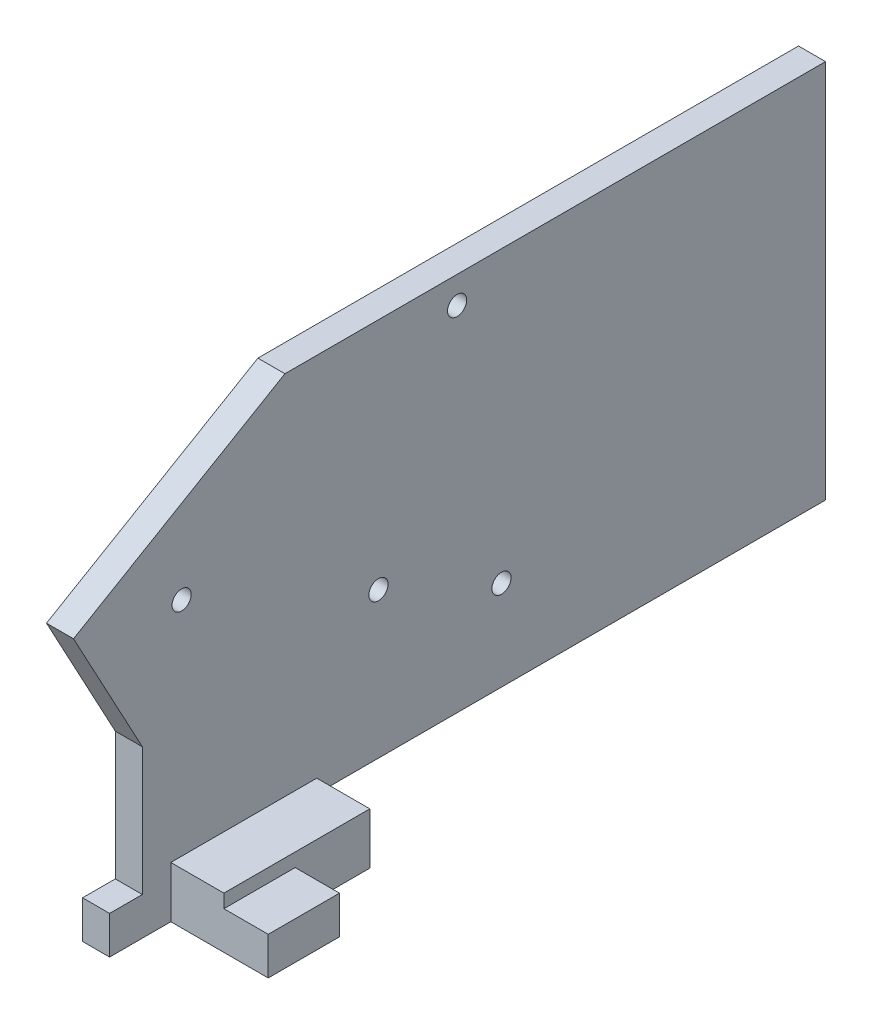
ISO-10303-21;
HEADER;
FILE_DESCRIPTION(('STEP AP214'),'2;1');
FILE_NAME('part.step','',(''),(''),'','','');
FILE_SCHEMA(('AUTOMOTIVE_DESIGN { 1 0 10303 214 1 1 1 1 }'));
ENDSEC;
DATA;
#1=APPLICATION_CONTEXT('core data for automotive mechanical design processes');
#2=APPLICATION_PROTOCOL_DEFINITION('international standard','automotive_design',2000,#1);
#3=PRODUCT_CONTEXT('',#1,'mechanical');
#4=PRODUCT('Part','Part','',(#3));
#5=PRODUCT_RELATED_PRODUCT_CATEGORY('part','',(#4));
#6=PRODUCT_DEFINITION_FORMATION('','',#4);
#7=PRODUCT_DEFINITION_CONTEXT('part definition',#1,'design');
#8=PRODUCT_DEFINITION('design','',#6,#7);
#9=PRODUCT_DEFINITION_SHAPE('','',#8);
#10=(LENGTH_UNIT() NAMED_UNIT(*) SI_UNIT(.MILLI.,.METRE.));
#11=(NAMED_UNIT(*) PLANE_ANGLE_UNIT() SI_UNIT($,.RADIAN.));
#12=(NAMED_UNIT(*) SI_UNIT($,.STERADIAN.) SOLID_ANGLE_UNIT());
#13=UNCERTAINTY_MEASURE_WITH_UNIT(LENGTH_MEASURE(1.E-05),#10,'distance_accuracy_value','');
#14=(GEOMETRIC_REPRESENTATION_CONTEXT(3) GLOBAL_UNCERTAINTY_ASSIGNED_CONTEXT((#13)) GLOBAL_UNIT_ASSIGNED_CONTEXT((#10,
#11,#12)) REPRESENTATION_CONTEXT('',''));
#15=CARTESIAN_POINT('',(0.,0.,0.));
#16=DIRECTION('',(0.,0.,1.));
#17=DIRECTION('',(1.,0.,0.));
#18=AXIS2_PLACEMENT_3D('',#15,#16,#17);
#19=CARTESIAN_POINT('',(-6.35,0.,-8.48062137768407));
#20=DIRECTION('',(0.,0.,-1.));
#21=DIRECTION('',(0.,1.,0.));
#22=AXIS2_PLACEMENT_3D('',#19,#20,#21);
#23=PLANE('',#22);
#24=DIRECTION('',(0.,1.,0.));
#25=VECTOR('',#24,1.);
#26=CARTESIAN_POINT('',(0.,0.,-8.48062137768407));
#27=LINE('',#26,#25);
#28=CARTESIAN_POINT('',(0.,-8.89,-8.48062137768407));
#29=VERTEX_POINT('',#28);
#30=CARTESIAN_POINT('',(0.,0.,-8.48062137768407));
#31=VERTEX_POINT('',#30);
#32=EDGE_CURVE('E200',#29,#31,#27,.T.);
#33=ORIENTED_EDGE('',*,*,#32,.T.);
#34=DIRECTION('',(1.,0.,0.));
#35=VECTOR('',#34,1.);
#36=CARTESIAN_POINT('',(-6.35,0.,-8.48062137768407));
#37=LINE('',#36,#35);
#38=CARTESIAN_POINT('',(-6.35,0.,-8.48062137768407));
#39=VERTEX_POINT('',#38);
#40=EDGE_CURVE('E45',#39,#31,#37,.T.);
#41=ORIENTED_EDGE('',*,*,#40,.F.);
#42=DIRECTION('',(0.,1.,0.));
#43=VECTOR('',#42,1.);
#44=CARTESIAN_POINT('',(-6.35,0.,-8.48062137768407));
#45=LINE('',#44,#43);
#46=CARTESIAN_POINT('',(-6.35,-8.89,-8.48062137768407));
#47=VERTEX_POINT('',#46);
#48=EDGE_CURVE('E201',#47,#39,#45,.T.);
#49=ORIENTED_EDGE('',*,*,#48,.F.);
#50=DIRECTION('',(1.,0.,0.));
#51=VECTOR('',#50,1.);
#52=CARTESIAN_POINT('',(-6.35,-8.89,-8.48062137768407));
#53=LINE('',#52,#51);
#54=EDGE_CURVE('E40',#47,#29,#53,.T.);
#55=ORIENTED_EDGE('',*,*,#54,.T.);
#56=EDGE_LOOP('',(#33,#41,#49,#55));
#57=FACE_BOUND('',#56,.T.);
#58=ADVANCED_FACE('F37',(#57),#23,.F.);
#59=CARTESIAN_POINT('',(-6.35,0.,0.));
#60=DIRECTION('',(0.,-1.,0.));
#61=DIRECTION('',(0.,0.,-1.));
#62=AXIS2_PLACEMENT_3D('',#59,#60,#61);
#63=PLANE('',#62);
#64=DIRECTION('',(0.,0.,-1.));
#65=VECTOR('',#64,1.);
#66=CARTESIAN_POINT('',(0.,0.,0.));
#67=LINE('',#66,#65);
#68=CARTESIAN_POINT('',(0.,0.,-16.170941539758));
#69=VERTEX_POINT('',#68);
#70=EDGE_CURVE('E260',#31,#69,#67,.T.);
#71=ORIENTED_EDGE('',*,*,#70,.T.);
#72=DIRECTION('',(1.,0.,0.));
#73=VECTOR('',#72,1.);
#74=CARTESIAN_POINT('',(-6.35,0.,-16.170941539758));
#75=LINE('',#74,#73);
#76=CARTESIAN_POINT('',(-6.35,0.,-16.170941539758));
#77=VERTEX_POINT('',#76);
#78=EDGE_CURVE('E276',#77,#69,#75,.T.);
#79=ORIENTED_EDGE('',*,*,#78,.F.);
#80=DIRECTION('',(0.,0.,-1.));
#81=VECTOR('',#80,1.);
#82=CARTESIAN_POINT('',(-6.35,0.,0.));
#83=LINE('',#82,#81);
#84=EDGE_CURVE('E225',#39,#77,#83,.T.);
#85=ORIENTED_EDGE('',*,*,#84,.F.);
#86=ORIENTED_EDGE('',*,*,#40,.T.);
#87=EDGE_LOOP('',(#71,#79,#85,#86));
#88=FACE_BOUND('',#87,.T.);
#89=ADVANCED_FACE('F309',(#88),#63,.F.);
#90=CARTESIAN_POINT('',(-6.35,0.,-16.170941539758));
#91=DIRECTION('',(0.,0.,1.));
#92=DIRECTION('',(0.,-1.,0.));
#93=AXIS2_PLACEMENT_3D('',#90,#91,#92);
#94=PLANE('',#93);
#95=DIRECTION('',(0.,-1.,0.));
#96=VECTOR('',#95,1.);
#97=CARTESIAN_POINT('',(0.,0.,-16.170941539758));
#98=LINE('',#97,#96);
#99=CARTESIAN_POINT('',(0.,30.0580976939271,-16.170941539758));
#100=VERTEX_POINT('',#99);
#101=EDGE_CURVE('E257',#100,#69,#98,.T.);
#102=ORIENTED_EDGE('',*,*,#101,.F.);
#103=DIRECTION('',(1.,0.,0.));
#104=VECTOR('',#103,1.);
#105=CARTESIAN_POINT('',(-6.35,30.0580976939271,-16.170941539758));
#106=LINE('',#105,#104);
#107=CARTESIAN_POINT('',(-6.35,30.0580976939271,-16.170941539758));
#108=VERTEX_POINT('',#107);
#109=EDGE_CURVE('E278',#108,#100,#106,.T.);
#110=ORIENTED_EDGE('',*,*,#109,.F.);
#111=DIRECTION('',(0.,-1.,0.));
#112=VECTOR('',#111,1.);
#113=CARTESIAN_POINT('',(-6.35,0.,-16.170941539758));
#114=LINE('',#113,#112);
#115=EDGE_CURVE('E222',#108,#77,#114,.T.);
#116=ORIENTED_EDGE('',*,*,#115,.T.);
#117=ORIENTED_EDGE('',*,*,#78,.T.);
#118=EDGE_LOOP('',(#102,#110,#116,#117));
#119=FACE_BOUND('',#118,.T.);
#120=ADVANCED_FACE('F334',(#119),#94,.T.);
#121=CARTESIAN_POINT('',(-6.35,13.4939914495989,-25.0822571014706));
#122=DIRECTION('',(0.,-0.473777543319094,0.880644559085289));
#123=DIRECTION('',(0.,-0.880644559085289,-0.473777543319095));
#124=AXIS2_PLACEMENT_3D('',#121,#122,#123);
#125=PLANE('',#124);
#126=DIRECTION('',(0.,-0.880644559085289,-0.473777543319095));
#127=VECTOR('',#126,1.);
#128=CARTESIAN_POINT('',(0.,13.4939914495989,-25.0822571014706));
#129=LINE('',#128,#127);
#130=CARTESIAN_POINT('',(0.,60.1161953878542,0.));
#131=VERTEX_POINT('',#130);
#132=EDGE_CURVE('E254',#131,#100,#129,.T.);
#133=ORIENTED_EDGE('',*,*,#132,.F.);
#134=DIRECTION('',(1.,0.,0.));
#135=VECTOR('',#134,1.);
#136=CARTESIAN_POINT('',(-6.35,60.1161953878542,0.));
#137=LINE('',#136,#135);
#138=CARTESIAN_POINT('',(-6.35,60.1161953878542,0.));
#139=VERTEX_POINT('',#138);
#140=EDGE_CURVE('E280',#139,#131,#137,.T.);
#141=ORIENTED_EDGE('',*,*,#140,.F.);
#142=DIRECTION('',(0.,-0.880644559085289,-0.473777543319095));
#143=VECTOR('',#142,1.);
#144=CARTESIAN_POINT('',(-6.35,13.4939914495989,-25.0822571014706));
#145=LINE('',#144,#143);
#146=EDGE_CURVE('E219',#139,#108,#145,.T.);
#147=ORIENTED_EDGE('',*,*,#146,.T.);
#148=ORIENTED_EDGE('',*,*,#109,.T.);
#149=EDGE_LOOP('',(#133,#141,#147,#148));
#150=FACE_BOUND('',#149,.T.);
#151=ADVANCED_FACE('F339',(#150),#125,.T.);
#152=CARTESIAN_POINT('',(-6.35,44.7635875945771,26.2152208413271));
#153=DIRECTION('',(0.,0.862912379131636,0.505353565280171));
#154=DIRECTION('',(0.,-0.505353565280171,0.862912379131636));
#155=AXIS2_PLACEMENT_3D('',#152,#153,#154);
#156=PLANE('',#155);
#157=DIRECTION('',(0.,-0.505353565280171,0.862912379131636));
#158=VECTOR('',#157,1.);
#159=CARTESIAN_POINT('',(0.,44.7635875945771,26.2152208413271));
#160=LINE('',#159,#158);
#161=CARTESIAN_POINT('',(0.,89.2048,-49.6700107331192));
#162=VERTEX_POINT('',#161);
#163=EDGE_CURVE('E251',#162,#131,#160,.T.);
#164=ORIENTED_EDGE('',*,*,#163,.F.);
#165=DIRECTION('',(1.,0.,0.));
#166=VECTOR('',#165,1.);
#167=CARTESIAN_POINT('',(-6.35,89.2048,-49.6700107331192));
#168=LINE('',#167,#166);
#169=CARTESIAN_POINT('',(-6.35,89.2048,-49.6700107331192));
#170=VERTEX_POINT('',#169);
#171=EDGE_CURVE('E282',#170,#162,#168,.T.);
#172=ORIENTED_EDGE('',*,*,#171,.F.);
#173=DIRECTION('',(0.,-0.505353565280171,0.862912379131636));
#174=VECTOR('',#173,1.);
#175=CARTESIAN_POINT('',(-6.35,44.7635875945771,26.2152208413271));
#176=LINE('',#175,#174);
#177=EDGE_CURVE('E216',#170,#139,#176,.T.);
#178=ORIENTED_EDGE('',*,*,#177,.T.);
#179=ORIENTED_EDGE('',*,*,#140,.T.);
#180=EDGE_LOOP('',(#164,#172,#178,#179));
#181=FACE_BOUND('',#180,.T.);
#182=ADVANCED_FACE('F346',(#181),#156,.T.);
#183=CARTESIAN_POINT('',(-6.35,89.2048,0.));
#184=DIRECTION('',(0.,-1.,0.));
#185=DIRECTION('',(0.,0.,-1.));
#186=AXIS2_PLACEMENT_3D('',#183,#184,#185);
#187=PLANE('',#186);
#188=DIRECTION('',(0.,0.,-1.));
#189=VECTOR('',#188,1.);
#190=CARTESIAN_POINT('',(0.,89.2048,0.));
#191=LINE('',#190,#189);
#192=CARTESIAN_POINT('',(0.,89.2048,-176.670010733119));
#193=VERTEX_POINT('',#192);
#194=EDGE_CURVE('E249',#162,#193,#191,.T.);
#195=ORIENTED_EDGE('',*,*,#194,.T.);
#196=DIRECTION('',(1.,0.,0.));
#197=VECTOR('',#196,1.);
#198=CARTESIAN_POINT('',(-6.35,89.2048,-176.670010733119));
#199=LINE('',#198,#197);
#200=CARTESIAN_POINT('',(-6.35,89.2048,-176.670010733119));
#201=VERTEX_POINT('',#200);
#202=EDGE_CURVE('E284',#201,#193,#199,.T.);
#203=ORIENTED_EDGE('',*,*,#202,.F.);
#204=DIRECTION('',(0.,0.,-1.));
#205=VECTOR('',#204,1.);
#206=CARTESIAN_POINT('',(-6.35,89.2048,0.));
#207=LINE('',#206,#205);
#208=EDGE_CURVE('E214',#170,#201,#207,.T.);
#209=ORIENTED_EDGE('',*,*,#208,.F.);
#210=ORIENTED_EDGE('',*,*,#171,.T.);
#211=EDGE_LOOP('',(#195,#203,#209,#210));
#212=FACE_BOUND('',#211,.T.);
#213=ADVANCED_FACE('F350',(#212),#187,.F.);
#214=CARTESIAN_POINT('',(-6.35,0.,-176.670010733119));
#215=DIRECTION('',(0.,0.,1.));
#216=DIRECTION('',(0.,-1.,0.));
#217=AXIS2_PLACEMENT_3D('',#214,#215,#216);
#218=PLANE('',#217);
#219=DIRECTION('',(0.,-1.,0.));
#220=VECTOR('',#219,1.);
#221=CARTESIAN_POINT('',(0.,0.,-176.670010733119));
#222=LINE('',#221,#220);
#223=CARTESIAN_POINT('',(0.,0.,-176.670010733119));
#224=VERTEX_POINT('',#223);
#225=EDGE_CURVE('E246',#193,#224,#222,.T.);
#226=ORIENTED_EDGE('',*,*,#225,.T.);
#227=DIRECTION('',(1.,0.,0.));
#228=VECTOR('',#227,1.);
#229=CARTESIAN_POINT('',(-6.35,0.,-176.670010733119));
#230=LINE('',#229,#228);
#231=CARTESIAN_POINT('',(-6.35,0.,-176.670010733119));
#232=VERTEX_POINT('',#231);
#233=EDGE_CURVE('E287',#232,#224,#230,.T.);
#234=ORIENTED_EDGE('',*,*,#233,.F.);
#235=DIRECTION('',(0.,-1.,0.));
#236=VECTOR('',#235,1.);
#237=CARTESIAN_POINT('',(-6.35,0.,-176.670010733119));
#238=LINE('',#237,#236);
#239=EDGE_CURVE('E212',#201,#232,#238,.T.);
#240=ORIENTED_EDGE('',*,*,#239,.F.);
#241=ORIENTED_EDGE('',*,*,#202,.T.);
#242=EDGE_LOOP('',(#226,#234,#240,#241));
#243=FACE_BOUND('',#242,.T.);
#244=ADVANCED_FACE('F354',(#243),#218,.F.);
#245=CARTESIAN_POINT('',(-6.35,0.,0.));
#246=DIRECTION('',(0.,-1.,0.));
#247=DIRECTION('',(0.,0.,-1.));
#248=AXIS2_PLACEMENT_3D('',#245,#246,#247);
#249=PLANE('',#248);
#250=DIRECTION('',(0.,0.,-1.));
#251=VECTOR('',#250,1.);
#252=CARTESIAN_POINT('',(0.,0.,0.));
#253=LINE('',#252,#251);
#254=CARTESIAN_POINT('',(0.,0.,-57.15));
#255=VERTEX_POINT('',#254);
#256=EDGE_CURVE('E243',#255,#224,#253,.T.);
#257=ORIENTED_EDGE('',*,*,#256,.F.);
#258=DIRECTION('',(1.,0.,0.));
#259=VECTOR('',#258,1.);
#260=CARTESIAN_POINT('',(-6.35,0.,-57.15));
#261=LINE('',#260,#259);
#262=CARTESIAN_POINT('',(-6.35,0.,-57.15));
#263=VERTEX_POINT('',#262);
#264=EDGE_CURVE('E289',#263,#255,#261,.T.);
#265=ORIENTED_EDGE('',*,*,#264,.F.);
#266=DIRECTION('',(0.,0.,-1.));
#267=VECTOR('',#266,1.);
#268=CARTESIAN_POINT('',(-6.35,0.,0.));
#269=LINE('',#268,#267);
#270=EDGE_CURVE('E209',#263,#232,#269,.T.);
#271=ORIENTED_EDGE('',*,*,#270,.T.);
#272=ORIENTED_EDGE('',*,*,#233,.T.);
#273=EDGE_LOOP('',(#257,#265,#271,#272));
#274=FACE_BOUND('',#273,.T.);
#275=ADVANCED_FACE('F358',(#274),#249,.T.);
#276=CARTESIAN_POINT('',(-6.35,0.,-57.15));
#277=DIRECTION('',(0.,0.,1.));
#278=DIRECTION('',(1.,0.,0.));
#279=AXIS2_PLACEMENT_3D('',#276,#277,#278);
#280=PLANE('',#279);
#281=ORIENTED_EDGE('',*,*,#264,.T.);
#282=DIRECTION('',(0.,1.,0.));
#283=VECTOR('',#282,1.);
#284=CARTESIAN_POINT('',(0.,0.,-57.15));
#285=LINE('',#284,#283);
#286=CARTESIAN_POINT('',(0.,3.175,-57.15));
#287=VERTEX_POINT('',#286);
#288=EDGE_CURVE('E11',#255,#287,#285,.T.);
#289=ORIENTED_EDGE('',*,*,#288,.T.);
#290=DIRECTION('',(-1.,0.,0.));
#291=VECTOR('',#290,1.);
#292=CARTESIAN_POINT('',(12.4714,3.175,-57.15));
#293=LINE('',#292,#291);
#294=CARTESIAN_POINT('',(12.4714,3.175,-57.15));
#295=VERTEX_POINT('',#294);
#296=EDGE_CURVE('E190',#295,#287,#293,.T.);
#297=ORIENTED_EDGE('',*,*,#296,.F.);
#298=DIRECTION('',(0.,1.,0.));
#299=VECTOR('',#298,1.);
#300=CARTESIAN_POINT('',(12.4714,0.,-57.15));
#301=LINE('',#300,#299);
#302=CARTESIAN_POINT('',(12.4714,-8.89,-57.15));
#303=VERTEX_POINT('',#302);
#304=EDGE_CURVE('E189',#303,#295,#301,.T.);
#305=ORIENTED_EDGE('',*,*,#304,.F.);
#306=DIRECTION('',(1.,0.,0.));
#307=VECTOR('',#306,1.);
#308=CARTESIAN_POINT('',(-6.35,-8.89,-57.15));
#309=LINE('',#308,#307);
#310=CARTESIAN_POINT('',(-6.35,-8.89,-57.15));
#311=VERTEX_POINT('',#310);
#312=EDGE_CURVE('E291',#311,#303,#309,.T.);
#313=ORIENTED_EDGE('',*,*,#312,.F.);
#314=DIRECTION('',(0.,-1.,0.));
#315=VECTOR('',#314,1.);
#316=CARTESIAN_POINT('',(-6.35,0.,-57.15));
#317=LINE('',#316,#315);
#318=EDGE_CURVE('E207',#263,#311,#317,.T.);
#319=ORIENTED_EDGE('',*,*,#318,.F.);
#320=EDGE_LOOP('',(#281,#289,#297,#305,#313,#319));
#321=FACE_BOUND('',#320,.T.);
#322=ADVANCED_FACE('F361',(#321),#280,.F.);
#323=CARTESIAN_POINT('',(-6.35,82.8548,-90.1192049843012));
#324=DIRECTION('',(1.,0.,0.));
#325=DIRECTION('',(0.,0.,-1.));
#326=AXIS2_PLACEMENT_3D('',#323,#324,#325);
#327=CYLINDRICAL_SURFACE('',#326,2.2479);
#328=CARTESIAN_POINT('',(-6.35,82.8548,-90.1192049843012));
#329=DIRECTION('',(1.,0.,0.));
#330=DIRECTION('',(0.,0.,-1.));
#331=AXIS2_PLACEMENT_3D('',#328,#329,#330);
#332=CIRCLE('',#331,2.2479);
#333=CARTESIAN_POINT('',(-6.35,82.8548,-92.3671049843012));
#334=VERTEX_POINT('',#333);
#335=EDGE_CURVE('E233',#334,#334,#332,.T.);
#336=ORIENTED_EDGE('',*,*,#335,.F.);
#337=EDGE_LOOP('',(#336));
#338=FACE_BOUND('',#337,.T.);
#339=CARTESIAN_POINT('',(0.,82.8548,-90.1192049843012));
#340=DIRECTION('',(1.,0.,0.));
#341=DIRECTION('',(0.,0.,-1.));
#342=AXIS2_PLACEMENT_3D('',#339,#340,#341);
#343=CIRCLE('',#342,2.2479);
#344=CARTESIAN_POINT('',(0.,82.8548,-92.3671049843012));
#345=VERTEX_POINT('',#344);
#346=EDGE_CURVE('E269',#345,#345,#343,.T.);
#347=ORIENTED_EDGE('',*,*,#346,.T.);
#348=EDGE_LOOP('',(#347));
#349=FACE_BOUND('',#348,.T.);
#350=ADVANCED_FACE('F364',(#338,#349),#327,.F.);
#351=CARTESIAN_POINT('',(-6.35,34.29,-71.6420655524815));
#352=DIRECTION('',(1.,0.,0.));
#353=DIRECTION('',(0.,0.,-1.));
#354=AXIS2_PLACEMENT_3D('',#351,#352,#353);
#355=CYLINDRICAL_SURFACE('',#354,2.2479);
#356=CARTESIAN_POINT('',(-6.35,34.29,-71.6420655524815));
#357=DIRECTION('',(1.,0.,0.));
#358=DIRECTION('',(0.,0.,-1.));
#359=AXIS2_PLACEMENT_3D('',#356,#357,#358);
#360=CIRCLE('',#359,2.2479);
#361=CARTESIAN_POINT('',(-6.35,34.29,-73.8899655524815));
#362=VERTEX_POINT('',#361);
#363=EDGE_CURVE('E230',#362,#362,#360,.T.);
#364=ORIENTED_EDGE('',*,*,#363,.F.);
#365=EDGE_LOOP('',(#364));
#366=FACE_BOUND('',#365,.T.);
#367=CARTESIAN_POINT('',(0.,34.29,-71.6420655524815));
#368=DIRECTION('',(1.,0.,0.));
#369=DIRECTION('',(0.,0.,-1.));
#370=AXIS2_PLACEMENT_3D('',#367,#368,#369);
#371=CIRCLE('',#370,2.2479);
#372=CARTESIAN_POINT('',(0.,34.29,-73.8899655524815));
#373=VERTEX_POINT('',#372);
#374=EDGE_CURVE('E266',#373,#373,#371,.T.);
#375=ORIENTED_EDGE('',*,*,#374,.T.);
#376=EDGE_LOOP('',(#375));
#377=FACE_BOUND('',#376,.T.);
#378=ADVANCED_FACE('F326',(#366,#377),#355,.F.);
#379=CARTESIAN_POINT('',(-6.35,21.1455,-100.543356522783));
#380=DIRECTION('',(1.,0.,0.));
#381=DIRECTION('',(0.,0.,-1.));
#382=AXIS2_PLACEMENT_3D('',#379,#380,#381);
#383=CYLINDRICAL_SURFACE('',#382,2.2479);
#384=CARTESIAN_POINT('',(-6.35,21.1455,-100.543356522783));
#385=DIRECTION('',(1.,0.,0.));
#386=DIRECTION('',(0.,0.,-1.));
#387=AXIS2_PLACEMENT_3D('',#384,#385,#386);
#388=CIRCLE('',#387,2.2479);
#389=CARTESIAN_POINT('',(-6.35,21.1455,-102.791256522783));
#390=VERTEX_POINT('',#389);
#391=EDGE_CURVE('E227',#390,#390,#388,.T.);
#392=ORIENTED_EDGE('',*,*,#391,.F.);
#393=EDGE_LOOP('',(#392));
#394=FACE_BOUND('',#393,.T.);
#395=CARTESIAN_POINT('',(0.,21.1455,-100.543356522783));
#396=DIRECTION('',(1.,0.,0.));
#397=DIRECTION('',(0.,0.,-1.));
#398=AXIS2_PLACEMENT_3D('',#395,#396,#397);
#399=CIRCLE('',#398,2.2479);
#400=CARTESIAN_POINT('',(0.,21.1455,-102.791256522783));
#401=VERTEX_POINT('',#400);
#402=EDGE_CURVE('E263',#401,#401,#399,.T.);
#403=ORIENTED_EDGE('',*,*,#402,.T.);
#404=EDGE_LOOP('',(#403));
#405=FACE_BOUND('',#404,.T.);
#406=ADVANCED_FACE('F319',(#394,#405),#383,.F.);
#407=CARTESIAN_POINT('',(-6.35,-8.89000000000001,0.));
#408=DIRECTION('',(0.,1.,0.));
#409=DIRECTION('',(0.,0.,1.));
#410=AXIS2_PLACEMENT_3D('',#407,#408,#409);
#411=PLANE('',#410);
#412=ORIENTED_EDGE('',*,*,#312,.T.);
#413=DIRECTION('',(0.,0.,1.));
#414=VECTOR('',#413,1.);
#415=CARTESIAN_POINT('',(12.4714,-8.89000000000001,0.));
#416=LINE('',#415,#414);
#417=CARTESIAN_POINT('',(12.4714,-8.89,-39.6000000000007));
#418=VERTEX_POINT('',#417);
#419=EDGE_CURVE('E187',#303,#418,#416,.T.);
#420=ORIENTED_EDGE('',*,*,#419,.T.);
#421=DIRECTION('',(-1.,0.,0.));
#422=VECTOR('',#421,1.);
#423=CARTESIAN_POINT('',(22.8854,-8.89,-39.6000000000007));
#424=LINE('',#423,#422);
#425=CARTESIAN_POINT('',(22.8854,-8.89,-39.6000000000007));
#426=VERTEX_POINT('',#425);
#427=EDGE_CURVE('E173',#426,#418,#424,.T.);
#428=ORIENTED_EDGE('',*,*,#427,.F.);
#429=DIRECTION('',(0.,0.,-1.));
#430=VECTOR('',#429,1.);
#431=CARTESIAN_POINT('',(22.8854,-8.89,-39.6000000000007));
#432=LINE('',#431,#430);
#433=CARTESIAN_POINT('',(22.8854,-8.89,-22.86));
#434=VERTEX_POINT('',#433);
#435=EDGE_CURVE('E159',#434,#426,#432,.T.);
#436=ORIENTED_EDGE('',*,*,#435,.F.);
#437=DIRECTION('',(-1.,0.,0.));
#438=VECTOR('',#437,1.);
#439=CARTESIAN_POINT('',(12.4714,-8.89,-22.86));
#440=LINE('',#439,#438);
#441=CARTESIAN_POINT('',(0.,-8.89,-22.86));
#442=VERTEX_POINT('',#441);
#443=EDGE_CURVE('E156',#434,#442,#440,.T.);
#444=ORIENTED_EDGE('',*,*,#443,.T.);
#445=DIRECTION('',(0.,0.,1.));
#446=VECTOR('',#445,1.);
#447=CARTESIAN_POINT('',(0.,-8.89000000000001,0.));
#448=LINE('',#447,#446);
#449=EDGE_CURVE('E241',#442,#29,#448,.T.);
#450=ORIENTED_EDGE('',*,*,#449,.T.);
#451=ORIENTED_EDGE('',*,*,#54,.F.);
#452=DIRECTION('',(0.,0.,1.));
#453=VECTOR('',#452,1.);
#454=CARTESIAN_POINT('',(-6.35,-8.89000000000001,0.));
#455=LINE('',#454,#453);
#456=EDGE_CURVE('E204',#311,#47,#455,.T.);
#457=ORIENTED_EDGE('',*,*,#456,.F.);
#458=EDGE_LOOP('',(#412,#420,#428,#436,#444,#450,#451,#457));
#459=FACE_BOUND('',#458,.T.);
#460=ADVANCED_FACE('F316',(#459),#411,.F.);
#461=CARTESIAN_POINT('',(-6.35,55.3212,-25.4));
#462=DIRECTION('',(1.,0.,0.));
#463=DIRECTION('',(0.,0.,-1.));
#464=AXIS2_PLACEMENT_3D('',#461,#462,#463);
#465=CYLINDRICAL_SURFACE('',#464,2.2479);
#466=CARTESIAN_POINT('',(-6.35,55.3212,-25.4));
#467=DIRECTION('',(1.,0.,0.));
#468=DIRECTION('',(0.,0.,-1.));
#469=AXIS2_PLACEMENT_3D('',#466,#467,#468);
#470=CIRCLE('',#469,2.2479);
#471=CARTESIAN_POINT('',(-6.35,55.3212,-27.6479));
#472=VERTEX_POINT('',#471);
#473=EDGE_CURVE('E236',#472,#472,#470,.T.);
#474=ORIENTED_EDGE('',*,*,#473,.F.);
#475=EDGE_LOOP('',(#474));
#476=FACE_BOUND('',#475,.T.);
#477=CARTESIAN_POINT('',(0.,55.3212,-25.4));
#478=DIRECTION('',(1.,0.,0.));
#479=DIRECTION('',(0.,0.,-1.));
#480=AXIS2_PLACEMENT_3D('',#477,#478,#479);
#481=CIRCLE('',#480,2.2479);
#482=CARTESIAN_POINT('',(0.,55.3212,-27.6479));
#483=VERTEX_POINT('',#482);
#484=EDGE_CURVE('E205',#483,#483,#481,.T.);
#485=ORIENTED_EDGE('',*,*,#484,.T.);
#486=EDGE_LOOP('',(#485));
#487=FACE_BOUND('',#486,.T.);
#488=ADVANCED_FACE('F318',(#476,#487),#465,.F.);
#489=CARTESIAN_POINT('',(-6.35,0.,0.));
#490=DIRECTION('',(1.,0.,0.));
#491=DIRECTION('',(0.,0.,-1.));
#492=AXIS2_PLACEMENT_3D('',#489,#490,#491);
#493=PLANE('',#492);
#494=ORIENTED_EDGE('',*,*,#48,.T.);
#495=ORIENTED_EDGE('',*,*,#84,.T.);
#496=ORIENTED_EDGE('',*,*,#115,.F.);
#497=ORIENTED_EDGE('',*,*,#146,.F.);
#498=ORIENTED_EDGE('',*,*,#177,.F.);
#499=ORIENTED_EDGE('',*,*,#208,.T.);
#500=ORIENTED_EDGE('',*,*,#239,.T.);
#501=ORIENTED_EDGE('',*,*,#270,.F.);
#502=ORIENTED_EDGE('',*,*,#318,.T.);
#503=ORIENTED_EDGE('',*,*,#456,.T.);
#504=EDGE_LOOP('',(#494,#495,#496,#497,#498,#499,#500,#501,#502,#503));
#505=FACE_BOUND('',#504,.T.);
#506=ORIENTED_EDGE('',*,*,#391,.T.);
#507=EDGE_LOOP('',(#506));
#508=FACE_BOUND('',#507,.T.);
#509=ORIENTED_EDGE('',*,*,#363,.T.);
#510=EDGE_LOOP('',(#509));
#511=FACE_BOUND('',#510,.T.);
#512=ORIENTED_EDGE('',*,*,#335,.T.);
#513=EDGE_LOOP('',(#512));
#514=FACE_BOUND('',#513,.T.);
#515=ORIENTED_EDGE('',*,*,#473,.T.);
#516=EDGE_LOOP('',(#515));
#517=FACE_BOUND('',#516,.T.);
#518=ADVANCED_FACE('F312',(#505,#508,#511,#514,#517),#493,.F.);
#519=CARTESIAN_POINT('',(0.,0.,0.));
#520=DIRECTION('',(1.,0.,0.));
#521=DIRECTION('',(0.,0.,-1.));
#522=AXIS2_PLACEMENT_3D('',#519,#520,#521);
#523=PLANE('',#522);
#524=ORIENTED_EDGE('',*,*,#288,.F.);
#525=ORIENTED_EDGE('',*,*,#256,.T.);
#526=ORIENTED_EDGE('',*,*,#225,.F.);
#527=ORIENTED_EDGE('',*,*,#194,.F.);
#528=ORIENTED_EDGE('',*,*,#163,.T.);
#529=ORIENTED_EDGE('',*,*,#132,.T.);
#530=ORIENTED_EDGE('',*,*,#101,.T.);
#531=ORIENTED_EDGE('',*,*,#70,.F.);
#532=ORIENTED_EDGE('',*,*,#32,.F.);
#533=ORIENTED_EDGE('',*,*,#449,.F.);
#534=DIRECTION('',(0.,1.,0.));
#535=VECTOR('',#534,1.);
#536=CARTESIAN_POINT('',(0.,0.,-22.86));
#537=LINE('',#536,#535);
#538=CARTESIAN_POINT('',(0.,3.175,-22.86));
#539=VERTEX_POINT('',#538);
#540=EDGE_CURVE('E176',#442,#539,#537,.T.);
#541=ORIENTED_EDGE('',*,*,#540,.T.);
#542=DIRECTION('',(0.,0.,-1.));
#543=VECTOR('',#542,1.);
#544=CARTESIAN_POINT('',(0.,3.175,0.));
#545=LINE('',#544,#543);
#546=EDGE_CURVE('E172',#539,#287,#545,.T.);
#547=ORIENTED_EDGE('',*,*,#546,.T.);
#548=EDGE_LOOP('',(#524,#525,#526,#527,#528,#529,#530,#531,#532,#533,#541,#547));
#549=FACE_BOUND('',#548,.T.);
#550=ORIENTED_EDGE('',*,*,#402,.F.);
#551=EDGE_LOOP('',(#550));
#552=FACE_BOUND('',#551,.T.);
#553=ORIENTED_EDGE('',*,*,#374,.F.);
#554=EDGE_LOOP('',(#553));
#555=FACE_BOUND('',#554,.T.);
#556=ORIENTED_EDGE('',*,*,#346,.F.);
#557=EDGE_LOOP('',(#556));
#558=FACE_BOUND('',#557,.T.);
#559=ORIENTED_EDGE('',*,*,#484,.F.);
#560=EDGE_LOOP('',(#559));
#561=FACE_BOUND('',#560,.T.);
#562=ADVANCED_FACE('F304',(#549,#552,#555,#558,#561),#523,.T.);
#563=CARTESIAN_POINT('',(12.4714,3.175,0.));
#564=DIRECTION('',(0.,1.,0.));
#565=DIRECTION('',(0.,0.,1.));
#566=AXIS2_PLACEMENT_3D('',#563,#564,#565);
#567=PLANE('',#566);
#568=ORIENTED_EDGE('',*,*,#546,.F.);
#569=DIRECTION('',(-1.,0.,0.));
#570=VECTOR('',#569,1.);
#571=CARTESIAN_POINT('',(12.4714,3.175,-22.86));
#572=LINE('',#571,#570);
#573=CARTESIAN_POINT('',(12.4714,3.175,-22.86));
#574=VERTEX_POINT('',#573);
#575=EDGE_CURVE('E197',#574,#539,#572,.T.);
#576=ORIENTED_EDGE('',*,*,#575,.F.);
#577=DIRECTION('',(0.,0.,-1.));
#578=VECTOR('',#577,1.);
#579=CARTESIAN_POINT('',(12.4714,3.175,0.));
#580=LINE('',#579,#578);
#581=EDGE_CURVE('E183',#574,#295,#580,.T.);
#582=ORIENTED_EDGE('',*,*,#581,.T.);
#583=ORIENTED_EDGE('',*,*,#296,.T.);
#584=EDGE_LOOP('',(#568,#576,#582,#583));
#585=FACE_BOUND('',#584,.T.);
#586=ADVANCED_FACE('F378',(#585),#567,.T.);
#587=CARTESIAN_POINT('',(12.4714,0.,-22.86));
#588=DIRECTION('',(0.,0.,1.));
#589=DIRECTION('',(1.,0.,0.));
#590=AXIS2_PLACEMENT_3D('',#587,#588,#589);
#591=PLANE('',#590);
#592=ORIENTED_EDGE('',*,*,#540,.F.);
#593=ORIENTED_EDGE('',*,*,#443,.F.);
#594=DIRECTION('',(0.,-1.,0.));
#595=VECTOR('',#594,1.);
#596=CARTESIAN_POINT('',(22.8854,-8.89,-22.86));
#597=LINE('',#596,#595);
#598=CARTESIAN_POINT('',(22.8854,0.,-22.86));
#599=VERTEX_POINT('',#598);
#600=EDGE_CURVE('E149',#599,#434,#597,.T.);
#601=ORIENTED_EDGE('',*,*,#600,.F.);
#602=DIRECTION('',(-1.,0.,0.));
#603=VECTOR('',#602,1.);
#604=CARTESIAN_POINT('',(22.8854,0.,-22.86));
#605=LINE('',#604,#603);
#606=CARTESIAN_POINT('',(12.4714,0.,-22.86));
#607=VERTEX_POINT('',#606);
#608=EDGE_CURVE('E154',#599,#607,#605,.T.);
#609=ORIENTED_EDGE('',*,*,#608,.T.);
#610=DIRECTION('',(0.,1.,0.));
#611=VECTOR('',#610,1.);
#612=CARTESIAN_POINT('',(12.4714,0.,-22.86));
#613=LINE('',#612,#611);
#614=EDGE_CURVE('E59',#607,#574,#613,.T.);
#615=ORIENTED_EDGE('',*,*,#614,.T.);
#616=ORIENTED_EDGE('',*,*,#575,.T.);
#617=EDGE_LOOP('',(#592,#593,#601,#609,#615,#616));
#618=FACE_BOUND('',#617,.T.);
#619=ADVANCED_FACE('F152',(#618),#591,.T.);
#620=CARTESIAN_POINT('',(12.4714,0.,0.));
#621=DIRECTION('',(1.,0.,0.));
#622=DIRECTION('',(0.,0.,-1.));
#623=AXIS2_PLACEMENT_3D('',#620,#621,#622);
#624=PLANE('',#623);
#625=DIRECTION('',(0.,0.,1.));
#626=VECTOR('',#625,1.);
#627=CARTESIAN_POINT('',(12.4714,0.,-22.86));
#628=LINE('',#627,#626);
#629=CARTESIAN_POINT('',(12.4714,0.,-39.6000000000007));
#630=VERTEX_POINT('',#629);
#631=EDGE_CURVE('E171',#630,#607,#628,.T.);
#632=ORIENTED_EDGE('',*,*,#631,.F.);
#633=DIRECTION('',(0.,1.,0.));
#634=VECTOR('',#633,1.);
#635=CARTESIAN_POINT('',(12.4714,0.,-39.6000000000007));
#636=LINE('',#635,#634);
#637=EDGE_CURVE('E53',#418,#630,#636,.T.);
#638=ORIENTED_EDGE('',*,*,#637,.F.);
#639=ORIENTED_EDGE('',*,*,#419,.F.);
#640=ORIENTED_EDGE('',*,*,#304,.T.);
#641=ORIENTED_EDGE('',*,*,#581,.F.);
#642=ORIENTED_EDGE('',*,*,#614,.F.);
#643=EDGE_LOOP('',(#632,#638,#639,#640,#641,#642));
#644=FACE_BOUND('',#643,.T.);
#645=ADVANCED_FACE('F379',(#644),#624,.T.);
#646=CARTESIAN_POINT('',(22.8854,0.,-22.86));
#647=DIRECTION('',(0.,-1.,0.));
#648=DIRECTION('',(0.,0.,-1.));
#649=AXIS2_PLACEMENT_3D('',#646,#647,#648);
#650=PLANE('',#649);
#651=ORIENTED_EDGE('',*,*,#631,.T.);
#652=ORIENTED_EDGE('',*,*,#608,.F.);
#653=DIRECTION('',(0.,0.,1.));
#654=VECTOR('',#653,1.);
#655=CARTESIAN_POINT('',(22.8854,0.,-22.86));
#656=LINE('',#655,#654);
#657=CARTESIAN_POINT('',(22.8854,0.,-39.6000000000007));
#658=VERTEX_POINT('',#657);
#659=EDGE_CURVE('E160',#658,#599,#656,.T.);
#660=ORIENTED_EDGE('',*,*,#659,.F.);
#661=DIRECTION('',(-1.,0.,0.));
#662=VECTOR('',#661,1.);
#663=CARTESIAN_POINT('',(22.8854,0.,-39.6000000000007));
#664=LINE('',#663,#662);
#665=EDGE_CURVE('E179',#658,#630,#664,.T.);
#666=ORIENTED_EDGE('',*,*,#665,.T.);
#667=EDGE_LOOP('',(#651,#652,#660,#666));
#668=FACE_BOUND('',#667,.T.);
#669=ADVANCED_FACE('F170',(#668),#650,.F.);
#670=CARTESIAN_POINT('',(22.8854,0.,-39.6000000000007));
#671=DIRECTION('',(0.,0.,1.));
#672=DIRECTION('',(1.,0.,0.));
#673=AXIS2_PLACEMENT_3D('',#670,#671,#672);
#674=PLANE('',#673);
#675=ORIENTED_EDGE('',*,*,#637,.T.);
#676=ORIENTED_EDGE('',*,*,#665,.F.);
#677=DIRECTION('',(0.,1.,0.));
#678=VECTOR('',#677,1.);
#679=CARTESIAN_POINT('',(22.8854,0.,-39.6000000000007));
#680=LINE('',#679,#678);
#681=EDGE_CURVE('E165',#426,#658,#680,.T.);
#682=ORIENTED_EDGE('',*,*,#681,.F.);
#683=ORIENTED_EDGE('',*,*,#427,.T.);
#684=EDGE_LOOP('',(#675,#676,#682,#683));
#685=FACE_BOUND('',#684,.T.);
#686=ADVANCED_FACE('F382',(#685),#674,.F.);
#687=CARTESIAN_POINT('',(22.8854,0.,0.));
#688=DIRECTION('',(-1.,0.,0.));
#689=DIRECTION('',(0.,0.,1.));
#690=AXIS2_PLACEMENT_3D('',#687,#688,#689);
#691=PLANE('',#690);
#692=ORIENTED_EDGE('',*,*,#659,.T.);
#693=ORIENTED_EDGE('',*,*,#600,.T.);
#694=ORIENTED_EDGE('',*,*,#435,.T.);
#695=ORIENTED_EDGE('',*,*,#681,.T.);
#696=EDGE_LOOP('',(#692,#693,#694,#695));
#697=FACE_BOUND('',#696,.T.);
#698=ADVANCED_FACE('F163',(#697),#691,.F.);
#699=CLOSED_SHELL('',(#58,#89,#120,#151,#182,#213,#244,#275,#322,#350,#378,#406,#460,#488,#518,
#562,#586,#619,#645,#669,#686,#698));
#700=MANIFOLD_SOLID_BREP('B2',#699);
#701=ADVANCED_BREP_SHAPE_REPRESENTATION('',(#18,#700),#14);
#702=SHAPE_DEFINITION_REPRESENTATION(#9,#701);
ENDSEC;
END-ISO-10303-21;
